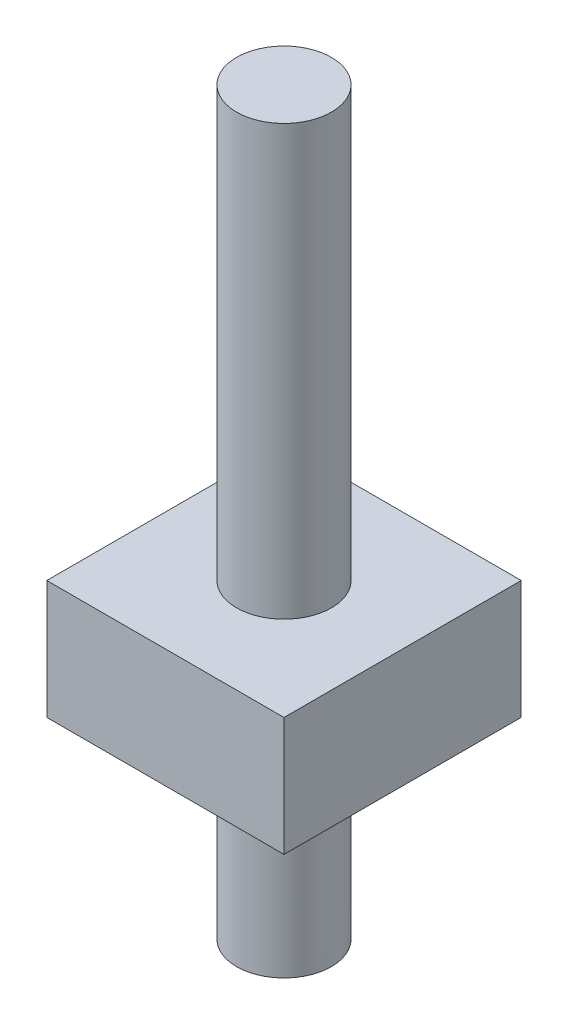
ISO-10303-21;
HEADER;
FILE_DESCRIPTION(('STEP AP214'),'2;1');
FILE_NAME('part.step','',(''),(''),'','','');
FILE_SCHEMA(('AUTOMOTIVE_DESIGN { 1 0 10303 214 1 1 1 1 }'));
ENDSEC;
DATA;
#1=APPLICATION_CONTEXT('core data for automotive mechanical design processes');
#2=APPLICATION_PROTOCOL_DEFINITION('international standard','automotive_design',2000,#1);
#3=PRODUCT_CONTEXT('',#1,'mechanical');
#4=PRODUCT('Part','Part','',(#3));
#5=PRODUCT_RELATED_PRODUCT_CATEGORY('part','',(#4));
#6=PRODUCT_DEFINITION_FORMATION('','',#4);
#7=PRODUCT_DEFINITION_CONTEXT('part definition',#1,'design');
#8=PRODUCT_DEFINITION('design','',#6,#7);
#9=PRODUCT_DEFINITION_SHAPE('','',#8);
#10=(LENGTH_UNIT() NAMED_UNIT(*) SI_UNIT(.MILLI.,.METRE.));
#11=(NAMED_UNIT(*) PLANE_ANGLE_UNIT() SI_UNIT($,.RADIAN.));
#12=(NAMED_UNIT(*) SI_UNIT($,.STERADIAN.) SOLID_ANGLE_UNIT());
#13=UNCERTAINTY_MEASURE_WITH_UNIT(LENGTH_MEASURE(1.E-05),#10,'distance_accuracy_value','');
#14=(GEOMETRIC_REPRESENTATION_CONTEXT(3) GLOBAL_UNCERTAINTY_ASSIGNED_CONTEXT((#13)) GLOBAL_UNIT_ASSIGNED_CONTEXT((#10,
#11,#12)) REPRESENTATION_CONTEXT('',''));
#15=CARTESIAN_POINT('',(0.,0.,0.));
#16=DIRECTION('',(0.,0.,1.));
#17=DIRECTION('',(1.,0.,0.));
#18=AXIS2_PLACEMENT_3D('',#15,#16,#17);
#19=CARTESIAN_POINT('',(0.,-15.6,0.));
#20=DIRECTION('',(0.,1.,0.));
#21=DIRECTION('',(0.,0.,1.));
#22=AXIS2_PLACEMENT_3D('',#19,#20,#21);
#23=CYLINDRICAL_SURFACE('',#22,2.);
#24=CARTESIAN_POINT('',(0.,-7.5,0.));
#25=DIRECTION('',(0.,-1.,0.));
#26=DIRECTION('',(0.,0.,-1.));
#27=AXIS2_PLACEMENT_3D('',#24,#25,#26);
#28=CIRCLE('',#27,2.);
#29=CARTESIAN_POINT('',(0.,-7.5,-2.));
#30=VERTEX_POINT('',#29);
#31=EDGE_CURVE('E11',#30,#30,#28,.F.);
#32=ORIENTED_EDGE('',*,*,#31,.F.);
#33=EDGE_LOOP('',(#32));
#34=FACE_BOUND('',#33,.T.);
#35=CARTESIAN_POINT('',(0.,-15.6,0.));
#36=DIRECTION('',(0.,1.,0.));
#37=DIRECTION('',(0.,0.,1.));
#38=AXIS2_PLACEMENT_3D('',#35,#36,#37);
#39=CIRCLE('',#38,2.);
#40=CARTESIAN_POINT('',(0.,-15.6,2.));
#41=VERTEX_POINT('',#40);
#42=EDGE_CURVE('E112',#41,#41,#39,.T.);
#43=ORIENTED_EDGE('',*,*,#42,.T.);
#44=EDGE_LOOP('',(#43));
#45=FACE_BOUND('',#44,.T.);
#46=ADVANCED_FACE('F33',(#34,#45),#23,.T.);
#47=CARTESIAN_POINT('',(0.,-15.6,0.));
#48=DIRECTION('',(0.,1.,0.));
#49=DIRECTION('',(0.,0.,1.));
#50=AXIS2_PLACEMENT_3D('',#47,#48,#49);
#51=PLANE('',#50);
#52=ORIENTED_EDGE('',*,*,#42,.F.);
#53=EDGE_LOOP('',(#52));
#54=FACE_BOUND('',#53,.T.);
#55=ADVANCED_FACE('F132',(#54),#51,.F.);
#56=CARTESIAN_POINT('',(-5.,-2.5,-5.));
#57=DIRECTION('',(0.,0.,-1.));
#58=DIRECTION('',(0.,1.,0.));
#59=AXIS2_PLACEMENT_3D('',#56,#57,#58);
#60=PLANE('',#59);
#61=DIRECTION('',(1.,0.,0.));
#62=VECTOR('',#61,1.);
#63=CARTESIAN_POINT('',(-5.,-2.5,-5.));
#64=LINE('',#63,#62);
#65=CARTESIAN_POINT('',(-5.,-2.5,-5.));
#66=VERTEX_POINT('',#65);
#67=CARTESIAN_POINT('',(5.,-2.5,-5.));
#68=VERTEX_POINT('',#67);
#69=EDGE_CURVE('E73',#66,#68,#64,.T.);
#70=ORIENTED_EDGE('',*,*,#69,.T.);
#71=DIRECTION('',(0.,1.,0.));
#72=VECTOR('',#71,1.);
#73=CARTESIAN_POINT('',(5.,-2.5,-5.));
#74=LINE('',#73,#72);
#75=CARTESIAN_POINT('',(5.,-7.5,-5.));
#76=VERTEX_POINT('',#75);
#77=EDGE_CURVE('E77',#76,#68,#74,.T.);
#78=ORIENTED_EDGE('',*,*,#77,.F.);
#79=DIRECTION('',(1.,0.,0.));
#80=VECTOR('',#79,1.);
#81=CARTESIAN_POINT('',(-5.,-7.5,-5.));
#82=LINE('',#81,#80);
#83=CARTESIAN_POINT('',(-5.,-7.5,-5.));
#84=VERTEX_POINT('',#83);
#85=EDGE_CURVE('E48',#84,#76,#82,.T.);
#86=ORIENTED_EDGE('',*,*,#85,.F.);
#87=DIRECTION('',(0.,1.,0.));
#88=VECTOR('',#87,1.);
#89=CARTESIAN_POINT('',(-5.,-2.5,-5.));
#90=LINE('',#89,#88);
#91=EDGE_CURVE('E78',#84,#66,#90,.T.);
#92=ORIENTED_EDGE('',*,*,#91,.T.);
#93=EDGE_LOOP('',(#70,#78,#86,#92));
#94=FACE_BOUND('',#93,.T.);
#95=ADVANCED_FACE('F75',(#94),#60,.T.);
#96=CARTESIAN_POINT('',(-5.,-7.5,5.));
#97=DIRECTION('',(0.,-1.,0.));
#98=DIRECTION('',(0.,0.,-1.));
#99=AXIS2_PLACEMENT_3D('',#96,#97,#98);
#100=PLANE('',#99);
#101=ORIENTED_EDGE('',*,*,#31,.T.);
#102=EDGE_LOOP('',(#101));
#103=FACE_BOUND('',#102,.T.);
#104=ORIENTED_EDGE('',*,*,#85,.T.);
#105=DIRECTION('',(0.,0.,-1.));
#106=VECTOR('',#105,1.);
#107=CARTESIAN_POINT('',(5.,-7.5,5.));
#108=LINE('',#107,#106);
#109=CARTESIAN_POINT('',(5.,-7.5,5.));
#110=VERTEX_POINT('',#109);
#111=EDGE_CURVE('E95',#110,#76,#108,.T.);
#112=ORIENTED_EDGE('',*,*,#111,.F.);
#113=DIRECTION('',(1.,0.,0.));
#114=VECTOR('',#113,1.);
#115=CARTESIAN_POINT('',(-5.,-7.5,5.));
#116=LINE('',#115,#114);
#117=CARTESIAN_POINT('',(-5.,-7.5,5.));
#118=VERTEX_POINT('',#117);
#119=EDGE_CURVE('E56',#118,#110,#116,.T.);
#120=ORIENTED_EDGE('',*,*,#119,.F.);
#121=DIRECTION('',(0.,0.,-1.));
#122=VECTOR('',#121,1.);
#123=CARTESIAN_POINT('',(-5.,-7.5,5.));
#124=LINE('',#123,#122);
#125=EDGE_CURVE('E83',#118,#84,#124,.T.);
#126=ORIENTED_EDGE('',*,*,#125,.T.);
#127=EDGE_LOOP('',(#104,#112,#120,#126));
#128=FACE_BOUND('',#127,.T.);
#129=ADVANCED_FACE('F142',(#103,#128),#100,.T.);
#130=CARTESIAN_POINT('',(-5.,-2.5,5.));
#131=DIRECTION('',(0.,0.,1.));
#132=DIRECTION('',(1.,0.,0.));
#133=AXIS2_PLACEMENT_3D('',#130,#131,#132);
#134=PLANE('',#133);
#135=ORIENTED_EDGE('',*,*,#119,.T.);
#136=DIRECTION('',(0.,-1.,0.));
#137=VECTOR('',#136,1.);
#138=CARTESIAN_POINT('',(5.,-2.5,5.));
#139=LINE('',#138,#137);
#140=CARTESIAN_POINT('',(5.,-2.5,5.));
#141=VERTEX_POINT('',#140);
#142=EDGE_CURVE('E91',#141,#110,#139,.T.);
#143=ORIENTED_EDGE('',*,*,#142,.F.);
#144=DIRECTION('',(1.,0.,0.));
#145=VECTOR('',#144,1.);
#146=CARTESIAN_POINT('',(-5.,-2.5,5.));
#147=LINE('',#146,#145);
#148=CARTESIAN_POINT('',(-5.,-2.5,5.));
#149=VERTEX_POINT('',#148);
#150=EDGE_CURVE('E82',#149,#141,#147,.T.);
#151=ORIENTED_EDGE('',*,*,#150,.F.);
#152=DIRECTION('',(0.,-1.,0.));
#153=VECTOR('',#152,1.);
#154=CARTESIAN_POINT('',(-5.,-2.5,5.));
#155=LINE('',#154,#153);
#156=EDGE_CURVE('E103',#149,#118,#155,.T.);
#157=ORIENTED_EDGE('',*,*,#156,.T.);
#158=EDGE_LOOP('',(#135,#143,#151,#157));
#159=FACE_BOUND('',#158,.T.);
#160=ADVANCED_FACE('F144',(#159),#134,.T.);
#161=CARTESIAN_POINT('',(-5.,-2.5,5.));
#162=DIRECTION('',(0.,1.,0.));
#163=DIRECTION('',(0.,0.,1.));
#164=AXIS2_PLACEMENT_3D('',#161,#162,#163);
#165=PLANE('',#164);
#166=CARTESIAN_POINT('',(0.,-2.5,0.));
#167=DIRECTION('',(0.,1.,0.));
#168=DIRECTION('',(0.,0.,1.));
#169=AXIS2_PLACEMENT_3D('',#166,#167,#168);
#170=CIRCLE('',#169,2.);
#171=CARTESIAN_POINT('',(0.,-2.5,2.));
#172=VERTEX_POINT('',#171);
#173=EDGE_CURVE('E41',#172,#172,#170,.F.);
#174=ORIENTED_EDGE('',*,*,#173,.T.);
#175=EDGE_LOOP('',(#174));
#176=FACE_BOUND('',#175,.T.);
#177=ORIENTED_EDGE('',*,*,#150,.T.);
#178=DIRECTION('',(0.,0.,1.));
#179=VECTOR('',#178,1.);
#180=CARTESIAN_POINT('',(5.,-2.5,5.));
#181=LINE('',#180,#179);
#182=EDGE_CURVE('E86',#68,#141,#181,.T.);
#183=ORIENTED_EDGE('',*,*,#182,.F.);
#184=ORIENTED_EDGE('',*,*,#69,.F.);
#185=DIRECTION('',(0.,0.,1.));
#186=VECTOR('',#185,1.);
#187=CARTESIAN_POINT('',(-5.,-2.5,5.));
#188=LINE('',#187,#186);
#189=EDGE_CURVE('E101',#66,#149,#188,.T.);
#190=ORIENTED_EDGE('',*,*,#189,.T.);
#191=EDGE_LOOP('',(#177,#183,#184,#190));
#192=FACE_BOUND('',#191,.T.);
#193=ADVANCED_FACE('F87',(#176,#192),#165,.T.);
#194=CARTESIAN_POINT('',(-5.,0.,0.));
#195=DIRECTION('',(1.,0.,0.));
#196=DIRECTION('',(0.,0.,-1.));
#197=AXIS2_PLACEMENT_3D('',#194,#195,#196);
#198=PLANE('',#197);
#199=ORIENTED_EDGE('',*,*,#91,.F.);
#200=ORIENTED_EDGE('',*,*,#125,.F.);
#201=ORIENTED_EDGE('',*,*,#156,.F.);
#202=ORIENTED_EDGE('',*,*,#189,.F.);
#203=EDGE_LOOP('',(#199,#200,#201,#202));
#204=FACE_BOUND('',#203,.T.);
#205=ADVANCED_FACE('F128',(#204),#198,.F.);
#206=CARTESIAN_POINT('',(5.,0.,0.));
#207=DIRECTION('',(1.,0.,0.));
#208=DIRECTION('',(0.,0.,-1.));
#209=AXIS2_PLACEMENT_3D('',#206,#207,#208);
#210=PLANE('',#209);
#211=ORIENTED_EDGE('',*,*,#77,.T.);
#212=ORIENTED_EDGE('',*,*,#182,.T.);
#213=ORIENTED_EDGE('',*,*,#142,.T.);
#214=ORIENTED_EDGE('',*,*,#111,.T.);
#215=EDGE_LOOP('',(#211,#212,#213,#214));
#216=FACE_BOUND('',#215,.T.);
#217=ADVANCED_FACE('F94',(#216),#210,.T.);
#218=CARTESIAN_POINT('',(0.,15.6,0.));
#219=DIRECTION('',(0.,1.,0.));
#220=DIRECTION('',(0.,0.,1.));
#221=AXIS2_PLACEMENT_3D('',#218,#219,#220);
#222=PLANE('',#221);
#223=CARTESIAN_POINT('',(0.,15.6,0.));
#224=DIRECTION('',(0.,1.,0.));
#225=DIRECTION('',(0.,0.,1.));
#226=AXIS2_PLACEMENT_3D('',#223,#224,#225);
#227=CIRCLE('',#226,2.);
#228=CARTESIAN_POINT('',(0.,15.6,2.));
#229=VERTEX_POINT('',#228);
#230=EDGE_CURVE('E107',#229,#229,#227,.T.);
#231=ORIENTED_EDGE('',*,*,#230,.T.);
#232=EDGE_LOOP('',(#231));
#233=FACE_BOUND('',#232,.T.);
#234=ADVANCED_FACE('F120',(#233),#222,.T.);
#235=ORIENTED_EDGE('',*,*,#173,.F.);
#236=EDGE_LOOP('',(#235));
#237=FACE_BOUND('',#236,.T.);
#238=ORIENTED_EDGE('',*,*,#230,.F.);
#239=EDGE_LOOP('',(#238));
#240=FACE_BOUND('',#239,.T.);
#241=ADVANCED_FACE('F35',(#237,#240),#23,.T.);
#242=CLOSED_SHELL('',(#46,#55,#95,#129,#160,#193,#205,#217,#234,#241));
#243=MANIFOLD_SOLID_BREP('B2',#242);
#244=ADVANCED_BREP_SHAPE_REPRESENTATION('',(#18,#243),#14);
#245=SHAPE_DEFINITION_REPRESENTATION(#9,#244);
ENDSEC;
END-ISO-10303-21;
